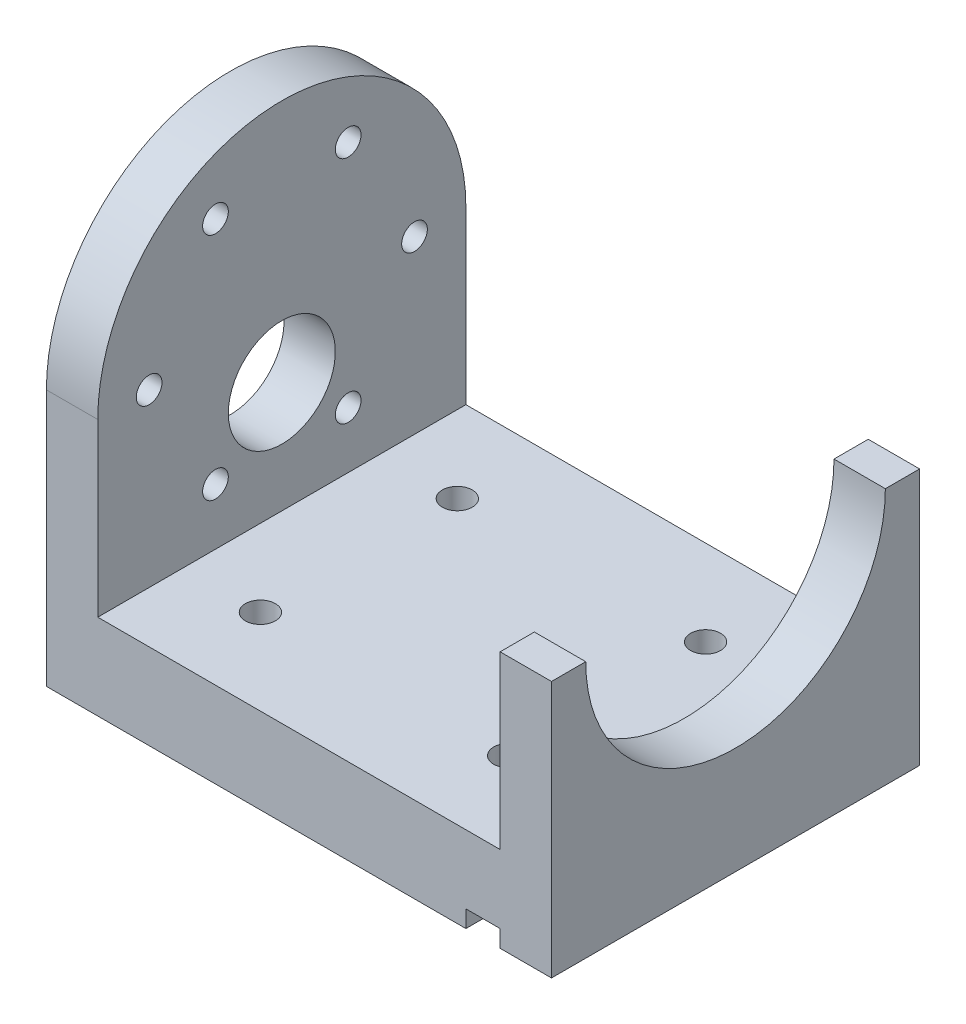
ISO-10303-21;
HEADER;
FILE_DESCRIPTION(('STEP AP214'),'2;1');
FILE_NAME('part.step','',(''),(''),'','','');
FILE_SCHEMA(('AUTOMOTIVE_DESIGN { 1 0 10303 214 1 1 1 1 }'));
ENDSEC;
DATA;
#1=APPLICATION_CONTEXT('core data for automotive mechanical design processes');
#2=APPLICATION_PROTOCOL_DEFINITION('international standard','automotive_design',2000,#1);
#3=PRODUCT_CONTEXT('',#1,'mechanical');
#4=PRODUCT('Part','Part','',(#3));
#5=PRODUCT_RELATED_PRODUCT_CATEGORY('part','',(#4));
#6=PRODUCT_DEFINITION_FORMATION('','',#4);
#7=PRODUCT_DEFINITION_CONTEXT('part definition',#1,'design');
#8=PRODUCT_DEFINITION('design','',#6,#7);
#9=PRODUCT_DEFINITION_SHAPE('','',#8);
#10=(LENGTH_UNIT() NAMED_UNIT(*) SI_UNIT(.MILLI.,.METRE.));
#11=(NAMED_UNIT(*) PLANE_ANGLE_UNIT() SI_UNIT($,.RADIAN.));
#12=(NAMED_UNIT(*) SI_UNIT($,.STERADIAN.) SOLID_ANGLE_UNIT());
#13=UNCERTAINTY_MEASURE_WITH_UNIT(LENGTH_MEASURE(1.E-05),#10,'distance_accuracy_value','');
#14=(GEOMETRIC_REPRESENTATION_CONTEXT(3) GLOBAL_UNCERTAINTY_ASSIGNED_CONTEXT((#13)) GLOBAL_UNIT_ASSIGNED_CONTEXT((#10,
#11,#12)) REPRESENTATION_CONTEXT('',''));
#15=CARTESIAN_POINT('',(0.,0.,0.));
#16=DIRECTION('',(0.,0.,1.));
#17=DIRECTION('',(1.,0.,0.));
#18=AXIS2_PLACEMENT_3D('',#15,#16,#17);
#19=CARTESIAN_POINT('',(0.,10.,0.));
#20=DIRECTION('',(0.,-1.,0.));
#21=DIRECTION('',(0.,0.,-1.));
#22=AXIS2_PLACEMENT_3D('',#19,#20,#21);
#23=PLANE('',#22);
#24=CARTESIAN_POINT('',(44.,10.,-10.));
#25=DIRECTION('',(0.,1.,0.));
#26=DIRECTION('',(0.,0.,1.));
#27=AXIS2_PLACEMENT_3D('',#24,#25,#26);
#28=CIRCLE('',#27,1.75);
#29=CARTESIAN_POINT('',(44.,10.,-8.25));
#30=VERTEX_POINT('',#29);
#31=EDGE_CURVE('E226',#30,#30,#28,.T.);
#32=ORIENTED_EDGE('',*,*,#31,.F.);
#33=EDGE_LOOP('',(#32));
#34=FACE_BOUND('',#33,.T.);
#35=CARTESIAN_POINT('',(44.,10.,-33.));
#36=DIRECTION('',(0.,1.,0.));
#37=DIRECTION('',(0.,0.,-1.));
#38=AXIS2_PLACEMENT_3D('',#35,#36,#37);
#39=CIRCLE('',#38,1.75);
#40=CARTESIAN_POINT('',(44.,10.,-34.75));
#41=VERTEX_POINT('',#40);
#42=EDGE_CURVE('E232',#41,#41,#39,.T.);
#43=ORIENTED_EDGE('',*,*,#42,.F.);
#44=EDGE_LOOP('',(#43));
#45=FACE_BOUND('',#44,.T.);
#46=CARTESIAN_POINT('',(15.,10.,-10.));
#47=DIRECTION('',(0.,1.,0.));
#48=DIRECTION('',(0.,0.,-1.));
#49=AXIS2_PLACEMENT_3D('',#46,#47,#48);
#50=CIRCLE('',#49,1.75);
#51=CARTESIAN_POINT('',(15.,10.,-11.75));
#52=VERTEX_POINT('',#51);
#53=EDGE_CURVE('E238',#52,#52,#50,.T.);
#54=ORIENTED_EDGE('',*,*,#53,.F.);
#55=EDGE_LOOP('',(#54));
#56=FACE_BOUND('',#55,.T.);
#57=CARTESIAN_POINT('',(15.,10.,-33.));
#58=DIRECTION('',(0.,1.,0.));
#59=DIRECTION('',(0.,0.,1.));
#60=AXIS2_PLACEMENT_3D('',#57,#58,#59);
#61=CIRCLE('',#60,1.75);
#62=CARTESIAN_POINT('',(15.,10.,-31.25));
#63=VERTEX_POINT('',#62);
#64=EDGE_CURVE('E244',#63,#63,#61,.T.);
#65=ORIENTED_EDGE('',*,*,#64,.F.);
#66=EDGE_LOOP('',(#65));
#67=FACE_BOUND('',#66,.T.);
#68=DIRECTION('',(0.,0.,1.));
#69=VECTOR('',#68,1.);
#70=CARTESIAN_POINT('',(6.,10.,-43.));
#71=LINE('',#70,#69);
#72=CARTESIAN_POINT('',(6.,10.,-43.));
#73=VERTEX_POINT('',#72);
#74=CARTESIAN_POINT('',(6.,10.,0.));
#75=VERTEX_POINT('',#74);
#76=EDGE_CURVE('E51',#73,#75,#71,.T.);
#77=ORIENTED_EDGE('',*,*,#76,.T.);
#78=DIRECTION('',(1.,0.,0.));
#79=VECTOR('',#78,1.);
#80=CARTESIAN_POINT('',(0.,10.,0.));
#81=LINE('',#80,#79);
#82=CARTESIAN_POINT('',(53.,10.,0.));
#83=VERTEX_POINT('',#82);
#84=EDGE_CURVE('E153',#75,#83,#81,.T.);
#85=ORIENTED_EDGE('',*,*,#84,.T.);
#86=DIRECTION('',(0.,0.,-1.));
#87=VECTOR('',#86,1.);
#88=CARTESIAN_POINT('',(53.,10.,0.));
#89=LINE('',#88,#87);
#90=CARTESIAN_POINT('',(53.,10.,-43.));
#91=VERTEX_POINT('',#90);
#92=EDGE_CURVE('E178',#83,#91,#89,.T.);
#93=ORIENTED_EDGE('',*,*,#92,.T.);
#94=DIRECTION('',(-1.,0.,0.));
#95=VECTOR('',#94,1.);
#96=CARTESIAN_POINT('',(0.,10.,-43.));
#97=LINE('',#96,#95);
#98=EDGE_CURVE('E56',#91,#73,#97,.T.);
#99=ORIENTED_EDGE('',*,*,#98,.T.);
#100=EDGE_LOOP('',(#77,#85,#93,#99));
#101=FACE_BOUND('',#100,.T.);
#102=ADVANCED_FACE('F36',(#34,#45,#56,#67,#101),#23,.F.);
#103=CARTESIAN_POINT('',(0.,0.,0.));
#104=DIRECTION('',(0.,-1.,0.));
#105=DIRECTION('',(0.,0.,-1.));
#106=AXIS2_PLACEMENT_3D('',#103,#104,#105);
#107=PLANE('',#106);
#108=DIRECTION('',(0.,0.,1.));
#109=VECTOR('',#108,1.);
#110=CARTESIAN_POINT('',(53.,0.,0.));
#111=LINE('',#110,#109);
#112=CARTESIAN_POINT('',(53.,0.,-43.));
#113=VERTEX_POINT('',#112);
#114=CARTESIAN_POINT('',(53.,0.,0.));
#115=VERTEX_POINT('',#114);
#116=EDGE_CURVE('E200',#113,#115,#111,.T.);
#117=ORIENTED_EDGE('',*,*,#116,.F.);
#118=DIRECTION('',(-1.,0.,0.));
#119=VECTOR('',#118,1.);
#120=CARTESIAN_POINT('',(0.,0.,-43.));
#121=LINE('',#120,#119);
#122=CARTESIAN_POINT('',(59.,0.,-43.));
#123=VERTEX_POINT('',#122);
#124=EDGE_CURVE('E251',#123,#113,#121,.T.);
#125=ORIENTED_EDGE('',*,*,#124,.F.);
#126=DIRECTION('',(0.,0.,-1.));
#127=VECTOR('',#126,1.);
#128=CARTESIAN_POINT('',(59.,0.,0.));
#129=LINE('',#128,#127);
#130=CARTESIAN_POINT('',(59.,0.,0.));
#131=VERTEX_POINT('',#130);
#132=EDGE_CURVE('E260',#131,#123,#129,.T.);
#133=ORIENTED_EDGE('',*,*,#132,.F.);
#134=DIRECTION('',(1.,0.,0.));
#135=VECTOR('',#134,1.);
#136=CARTESIAN_POINT('',(0.,0.,0.));
#137=LINE('',#136,#135);
#138=EDGE_CURVE('E256',#115,#131,#137,.T.);
#139=ORIENTED_EDGE('',*,*,#138,.F.);
#140=EDGE_LOOP('',(#117,#125,#133,#139));
#141=FACE_BOUND('',#140,.T.);
#142=ADVANCED_FACE('F279',(#141),#107,.T.);
#143=DIRECTION('',(0.,0.,-1.));
#144=VECTOR('',#143,1.);
#145=CARTESIAN_POINT('',(49.,0.,0.));
#146=LINE('',#145,#144);
#147=CARTESIAN_POINT('',(49.,0.,0.));
#148=VERTEX_POINT('',#147);
#149=CARTESIAN_POINT('',(49.,0.,-43.));
#150=VERTEX_POINT('',#149);
#151=EDGE_CURVE('E205',#148,#150,#146,.T.);
#152=ORIENTED_EDGE('',*,*,#151,.F.);
#153=CARTESIAN_POINT('',(0.,0.,0.));
#154=VERTEX_POINT('',#153);
#155=EDGE_CURVE('E257',#154,#148,#137,.T.);
#156=ORIENTED_EDGE('',*,*,#155,.F.);
#157=DIRECTION('',(0.,0.,1.));
#158=VECTOR('',#157,1.);
#159=CARTESIAN_POINT('',(0.,0.,0.));
#160=LINE('',#159,#158);
#161=CARTESIAN_POINT('',(0.,0.,-43.));
#162=VERTEX_POINT('',#161);
#163=EDGE_CURVE('E247',#162,#154,#160,.T.);
#164=ORIENTED_EDGE('',*,*,#163,.F.);
#165=EDGE_CURVE('E262',#150,#162,#121,.T.);
#166=ORIENTED_EDGE('',*,*,#165,.F.);
#167=EDGE_LOOP('',(#152,#156,#164,#166));
#168=FACE_BOUND('',#167,.T.);
#169=CARTESIAN_POINT('',(44.,0.,-33.));
#170=DIRECTION('',(0.,1.,0.));
#171=DIRECTION('',(0.,0.,-1.));
#172=AXIS2_PLACEMENT_3D('',#169,#170,#171);
#173=CIRCLE('',#172,1.75);
#174=CARTESIAN_POINT('',(44.,0.,-34.75));
#175=VERTEX_POINT('',#174);
#176=EDGE_CURVE('E229',#175,#175,#173,.T.);
#177=ORIENTED_EDGE('',*,*,#176,.T.);
#178=EDGE_LOOP('',(#177));
#179=FACE_BOUND('',#178,.T.);
#180=CARTESIAN_POINT('',(15.,0.,-33.));
#181=DIRECTION('',(0.,1.,0.));
#182=DIRECTION('',(0.,0.,1.));
#183=AXIS2_PLACEMENT_3D('',#180,#181,#182);
#184=CIRCLE('',#183,1.75);
#185=CARTESIAN_POINT('',(15.,0.,-31.25));
#186=VERTEX_POINT('',#185);
#187=EDGE_CURVE('E241',#186,#186,#184,.T.);
#188=ORIENTED_EDGE('',*,*,#187,.T.);
#189=EDGE_LOOP('',(#188));
#190=FACE_BOUND('',#189,.T.);
#191=CARTESIAN_POINT('',(15.,0.,-10.));
#192=DIRECTION('',(0.,1.,0.));
#193=DIRECTION('',(0.,0.,-1.));
#194=AXIS2_PLACEMENT_3D('',#191,#192,#193);
#195=CIRCLE('',#194,1.75);
#196=CARTESIAN_POINT('',(15.,0.,-11.75));
#197=VERTEX_POINT('',#196);
#198=EDGE_CURVE('E235',#197,#197,#195,.T.);
#199=ORIENTED_EDGE('',*,*,#198,.T.);
#200=EDGE_LOOP('',(#199));
#201=FACE_BOUND('',#200,.T.);
#202=CARTESIAN_POINT('',(44.,0.,-10.));
#203=DIRECTION('',(0.,1.,0.));
#204=DIRECTION('',(0.,0.,1.));
#205=AXIS2_PLACEMENT_3D('',#202,#203,#204);
#206=CIRCLE('',#205,1.75);
#207=CARTESIAN_POINT('',(44.,0.,-8.25));
#208=VERTEX_POINT('',#207);
#209=EDGE_CURVE('E218',#208,#208,#206,.T.);
#210=ORIENTED_EDGE('',*,*,#209,.T.);
#211=EDGE_LOOP('',(#210));
#212=FACE_BOUND('',#211,.T.);
#213=ADVANCED_FACE('F354',(#168,#179,#190,#201,#212),#107,.T.);
#214=CARTESIAN_POINT('',(0.,10.,0.));
#215=DIRECTION('',(1.,0.,0.));
#216=DIRECTION('',(0.,0.,-1.));
#217=AXIS2_PLACEMENT_3D('',#214,#215,#216);
#218=PLANE('',#217);
#219=ORIENTED_EDGE('',*,*,#163,.T.);
#220=DIRECTION('',(0.,-1.,0.));
#221=VECTOR('',#220,1.);
#222=CARTESIAN_POINT('',(0.,10.,0.));
#223=LINE('',#222,#221);
#224=CARTESIAN_POINT('',(0.,30.,0.));
#225=VERTEX_POINT('',#224);
#226=EDGE_CURVE('E11',#225,#154,#223,.T.);
#227=ORIENTED_EDGE('',*,*,#226,.F.);
#228=CARTESIAN_POINT('',(0.,30.,-21.5));
#229=DIRECTION('',(-1.,0.,0.));
#230=DIRECTION('',(0.,0.,1.));
#231=AXIS2_PLACEMENT_3D('',#228,#229,#230);
#232=CIRCLE('',#231,21.5);
#233=CARTESIAN_POINT('',(0.,30.,-43.));
#234=VERTEX_POINT('',#233);
#235=EDGE_CURVE('E144',#225,#234,#232,.T.);
#236=ORIENTED_EDGE('',*,*,#235,.T.);
#237=DIRECTION('',(0.,-1.,0.));
#238=VECTOR('',#237,1.);
#239=CARTESIAN_POINT('',(0.,10.,-43.));
#240=LINE('',#239,#238);
#241=EDGE_CURVE('E253',#234,#162,#240,.T.);
#242=ORIENTED_EDGE('',*,*,#241,.T.);
#243=EDGE_LOOP('',(#219,#227,#236,#242));
#244=FACE_BOUND('',#243,.T.);
#245=CARTESIAN_POINT('',(0.,43.4233937586588,-13.75));
#246=DIRECTION('',(-1.,0.,0.));
#247=DIRECTION('',(0.,0.,1.));
#248=AXIS2_PLACEMENT_3D('',#245,#246,#247);
#249=CIRCLE('',#248,1.5);
#250=CARTESIAN_POINT('',(0.,43.4233937586588,-12.25));
#251=VERTEX_POINT('',#250);
#252=EDGE_CURVE('E337',#251,#251,#249,.T.);
#253=ORIENTED_EDGE('',*,*,#252,.F.);
#254=EDGE_LOOP('',(#253));
#255=FACE_BOUND('',#254,.T.);
#256=CARTESIAN_POINT('',(0.,43.4233937586588,-29.25));
#257=DIRECTION('',(-1.,0.,0.));
#258=DIRECTION('',(0.,0.,1.));
#259=AXIS2_PLACEMENT_3D('',#256,#257,#258);
#260=CIRCLE('',#259,1.5);
#261=CARTESIAN_POINT('',(0.,43.4233937586588,-27.75));
#262=VERTEX_POINT('',#261);
#263=EDGE_CURVE('E331',#262,#262,#260,.T.);
#264=ORIENTED_EDGE('',*,*,#263,.F.);
#265=EDGE_LOOP('',(#264));
#266=FACE_BOUND('',#265,.T.);
#267=CARTESIAN_POINT('',(0.,30.,-37.));
#268=DIRECTION('',(-1.,0.,0.));
#269=DIRECTION('',(0.,0.,1.));
#270=AXIS2_PLACEMENT_3D('',#267,#268,#269);
#271=CIRCLE('',#270,1.5);
#272=CARTESIAN_POINT('',(0.,30.,-35.5));
#273=VERTEX_POINT('',#272);
#274=EDGE_CURVE('E325',#273,#273,#271,.T.);
#275=ORIENTED_EDGE('',*,*,#274,.F.);
#276=EDGE_LOOP('',(#275));
#277=FACE_BOUND('',#276,.T.);
#278=CARTESIAN_POINT('',(0.,16.5766062413412,-29.25));
#279=DIRECTION('',(-1.,0.,0.));
#280=DIRECTION('',(0.,0.,1.));
#281=AXIS2_PLACEMENT_3D('',#278,#279,#280);
#282=CIRCLE('',#281,1.5);
#283=CARTESIAN_POINT('',(0.,16.5766062413412,-27.75));
#284=VERTEX_POINT('',#283);
#285=EDGE_CURVE('E319',#284,#284,#282,.T.);
#286=ORIENTED_EDGE('',*,*,#285,.F.);
#287=EDGE_LOOP('',(#286));
#288=FACE_BOUND('',#287,.T.);
#289=CARTESIAN_POINT('',(0.,16.5766062413412,-13.75));
#290=DIRECTION('',(-1.,0.,0.));
#291=DIRECTION('',(0.,0.,1.));
#292=AXIS2_PLACEMENT_3D('',#289,#290,#291);
#293=CIRCLE('',#292,1.5);
#294=CARTESIAN_POINT('',(0.,16.5766062413412,-12.25));
#295=VERTEX_POINT('',#294);
#296=EDGE_CURVE('E313',#295,#295,#293,.T.);
#297=ORIENTED_EDGE('',*,*,#296,.F.);
#298=EDGE_LOOP('',(#297));
#299=FACE_BOUND('',#298,.T.);
#300=CARTESIAN_POINT('',(0.,30.,-6.));
#301=DIRECTION('',(-1.,0.,0.));
#302=DIRECTION('',(0.,0.,1.));
#303=AXIS2_PLACEMENT_3D('',#300,#301,#302);
#304=CIRCLE('',#303,1.5);
#305=CARTESIAN_POINT('',(0.,30.,-4.5));
#306=VERTEX_POINT('',#305);
#307=EDGE_CURVE('E307',#306,#306,#304,.T.);
#308=ORIENTED_EDGE('',*,*,#307,.F.);
#309=EDGE_LOOP('',(#308));
#310=FACE_BOUND('',#309,.T.);
#311=CARTESIAN_POINT('',(0.,23.,-21.5));
#312=DIRECTION('',(-1.,0.,0.));
#313=DIRECTION('',(0.,0.,1.));
#314=AXIS2_PLACEMENT_3D('',#311,#312,#313);
#315=CIRCLE('',#314,6.25);
#316=CARTESIAN_POINT('',(0.,23.,-15.25));
#317=VERTEX_POINT('',#316);
#318=EDGE_CURVE('E301',#317,#317,#315,.T.);
#319=ORIENTED_EDGE('',*,*,#318,.F.);
#320=EDGE_LOOP('',(#319));
#321=FACE_BOUND('',#320,.T.);
#322=ADVANCED_FACE('F38',(#244,#255,#266,#277,#288,#299,#310,#321),#218,.F.);
#323=CARTESIAN_POINT('',(0.,10.,0.));
#324=DIRECTION('',(0.,0.,-1.));
#325=DIRECTION('',(-1.,0.,0.));
#326=AXIS2_PLACEMENT_3D('',#323,#324,#325);
#327=PLANE('',#326);
#328=DIRECTION('',(-1.,0.,0.));
#329=VECTOR('',#328,1.);
#330=CARTESIAN_POINT('',(53.,2.,0.));
#331=LINE('',#330,#329);
#332=CARTESIAN_POINT('',(53.,2.,0.));
#333=VERTEX_POINT('',#332);
#334=CARTESIAN_POINT('',(49.,2.,0.));
#335=VERTEX_POINT('',#334);
#336=EDGE_CURVE('E204',#333,#335,#331,.T.);
#337=ORIENTED_EDGE('',*,*,#336,.F.);
#338=DIRECTION('',(0.,-1.,0.));
#339=VECTOR('',#338,1.);
#340=CARTESIAN_POINT('',(53.,2.,0.));
#341=LINE('',#340,#339);
#342=EDGE_CURVE('E213',#333,#115,#341,.T.);
#343=ORIENTED_EDGE('',*,*,#342,.T.);
#344=ORIENTED_EDGE('',*,*,#138,.T.);
#345=DIRECTION('',(0.,-1.,0.));
#346=VECTOR('',#345,1.);
#347=CARTESIAN_POINT('',(59.,10.,0.));
#348=LINE('',#347,#346);
#349=CARTESIAN_POINT('',(59.,30.,0.));
#350=VERTEX_POINT('',#349);
#351=EDGE_CURVE('E44',#350,#131,#348,.T.);
#352=ORIENTED_EDGE('',*,*,#351,.F.);
#353=DIRECTION('',(1.,0.,0.));
#354=VECTOR('',#353,1.);
#355=CARTESIAN_POINT('',(53.,30.,0.));
#356=LINE('',#355,#354);
#357=CARTESIAN_POINT('',(53.,30.,0.));
#358=VERTEX_POINT('',#357);
#359=EDGE_CURVE('E182',#358,#350,#356,.T.);
#360=ORIENTED_EDGE('',*,*,#359,.F.);
#361=DIRECTION('',(0.,1.,0.));
#362=VECTOR('',#361,1.);
#363=CARTESIAN_POINT('',(53.,10.,0.));
#364=LINE('',#363,#362);
#365=EDGE_CURVE('E180',#83,#358,#364,.T.);
#366=ORIENTED_EDGE('',*,*,#365,.F.);
#367=ORIENTED_EDGE('',*,*,#84,.F.);
#368=DIRECTION('',(0.,1.,0.));
#369=VECTOR('',#368,1.);
#370=CARTESIAN_POINT('',(6.,10.,0.));
#371=LINE('',#370,#369);
#372=CARTESIAN_POINT('',(6.,30.,0.));
#373=VERTEX_POINT('',#372);
#374=EDGE_CURVE('E149',#75,#373,#371,.T.);
#375=ORIENTED_EDGE('',*,*,#374,.T.);
#376=DIRECTION('',(-1.,0.,0.));
#377=VECTOR('',#376,1.);
#378=CARTESIAN_POINT('',(6.,30.,0.));
#379=LINE('',#378,#377);
#380=EDGE_CURVE('E137',#373,#225,#379,.T.);
#381=ORIENTED_EDGE('',*,*,#380,.T.);
#382=ORIENTED_EDGE('',*,*,#226,.T.);
#383=ORIENTED_EDGE('',*,*,#155,.T.);
#384=DIRECTION('',(0.,-1.,0.));
#385=VECTOR('',#384,1.);
#386=CARTESIAN_POINT('',(49.,2.,0.));
#387=LINE('',#386,#385);
#388=EDGE_CURVE('E222',#335,#148,#387,.T.);
#389=ORIENTED_EDGE('',*,*,#388,.F.);
#390=EDGE_LOOP('',(#337,#343,#344,#352,#360,#366,#367,#375,#381,#382,#383,#389));
#391=FACE_BOUND('',#390,.T.);
#392=ADVANCED_FACE('F151',(#391),#327,.F.);
#393=CARTESIAN_POINT('',(59.,10.,0.));
#394=DIRECTION('',(-1.,0.,0.));
#395=DIRECTION('',(0.,0.,1.));
#396=AXIS2_PLACEMENT_3D('',#393,#394,#395);
#397=PLANE('',#396);
#398=ORIENTED_EDGE('',*,*,#132,.T.);
#399=DIRECTION('',(0.,-1.,0.));
#400=VECTOR('',#399,1.);
#401=CARTESIAN_POINT('',(59.,10.,-43.));
#402=LINE('',#401,#400);
#403=CARTESIAN_POINT('',(59.,30.,-43.));
#404=VERTEX_POINT('',#403);
#405=EDGE_CURVE('E267',#404,#123,#402,.T.);
#406=ORIENTED_EDGE('',*,*,#405,.F.);
#407=DIRECTION('',(0.,0.,-1.));
#408=VECTOR('',#407,1.);
#409=CARTESIAN_POINT('',(59.,30.,-39.));
#410=LINE('',#409,#408);
#411=CARTESIAN_POINT('',(59.,30.,-39.));
#412=VERTEX_POINT('',#411);
#413=EDGE_CURVE('E171',#412,#404,#410,.T.);
#414=ORIENTED_EDGE('',*,*,#413,.F.);
#415=CARTESIAN_POINT('',(59.,30.,-21.5));
#416=DIRECTION('',(1.,0.,0.));
#417=DIRECTION('',(0.,0.,-1.));
#418=AXIS2_PLACEMENT_3D('',#415,#416,#417);
#419=CIRCLE('',#418,17.5);
#420=CARTESIAN_POINT('',(59.,30.,-3.99999999999999));
#421=VERTEX_POINT('',#420);
#422=EDGE_CURVE('E185',#421,#412,#419,.T.);
#423=ORIENTED_EDGE('',*,*,#422,.F.);
#424=DIRECTION('',(0.,0.,-1.));
#425=VECTOR('',#424,1.);
#426=CARTESIAN_POINT('',(59.,30.,0.));
#427=LINE('',#426,#425);
#428=EDGE_CURVE('E165',#350,#421,#427,.T.);
#429=ORIENTED_EDGE('',*,*,#428,.F.);
#430=ORIENTED_EDGE('',*,*,#351,.T.);
#431=EDGE_LOOP('',(#398,#406,#414,#423,#429,#430));
#432=FACE_BOUND('',#431,.T.);
#433=ADVANCED_FACE('F273',(#432),#397,.F.);
#434=CARTESIAN_POINT('',(0.,10.,-43.));
#435=DIRECTION('',(0.,0.,1.));
#436=DIRECTION('',(1.,0.,0.));
#437=AXIS2_PLACEMENT_3D('',#434,#435,#436);
#438=PLANE('',#437);
#439=ORIENTED_EDGE('',*,*,#124,.T.);
#440=DIRECTION('',(0.,-1.,0.));
#441=VECTOR('',#440,1.);
#442=CARTESIAN_POINT('',(53.,2.,-43.));
#443=LINE('',#442,#441);
#444=CARTESIAN_POINT('',(53.,2.,-43.));
#445=VERTEX_POINT('',#444);
#446=EDGE_CURVE('E216',#445,#113,#443,.T.);
#447=ORIENTED_EDGE('',*,*,#446,.F.);
#448=DIRECTION('',(1.,0.,0.));
#449=VECTOR('',#448,1.);
#450=CARTESIAN_POINT('',(53.,2.,-43.));
#451=LINE('',#450,#449);
#452=CARTESIAN_POINT('',(49.,2.,-43.));
#453=VERTEX_POINT('',#452);
#454=EDGE_CURVE('E210',#453,#445,#451,.T.);
#455=ORIENTED_EDGE('',*,*,#454,.F.);
#456=DIRECTION('',(0.,-1.,0.));
#457=VECTOR('',#456,1.);
#458=CARTESIAN_POINT('',(49.,2.,-43.));
#459=LINE('',#458,#457);
#460=EDGE_CURVE('E219',#453,#150,#459,.T.);
#461=ORIENTED_EDGE('',*,*,#460,.T.);
#462=ORIENTED_EDGE('',*,*,#165,.T.);
#463=ORIENTED_EDGE('',*,*,#241,.F.);
#464=DIRECTION('',(-1.,0.,0.));
#465=VECTOR('',#464,1.);
#466=CARTESIAN_POINT('',(6.,30.,-43.));
#467=LINE('',#466,#465);
#468=CARTESIAN_POINT('',(6.,30.,-43.));
#469=VERTEX_POINT('',#468);
#470=EDGE_CURVE('E146',#469,#234,#467,.T.);
#471=ORIENTED_EDGE('',*,*,#470,.F.);
#472=DIRECTION('',(0.,-1.,0.));
#473=VECTOR('',#472,1.);
#474=CARTESIAN_POINT('',(6.,10.,-43.));
#475=LINE('',#474,#473);
#476=EDGE_CURVE('E159',#469,#73,#475,.T.);
#477=ORIENTED_EDGE('',*,*,#476,.T.);
#478=ORIENTED_EDGE('',*,*,#98,.F.);
#479=DIRECTION('',(0.,1.,0.));
#480=VECTOR('',#479,1.);
#481=CARTESIAN_POINT('',(53.,10.,-43.));
#482=LINE('',#481,#480);
#483=CARTESIAN_POINT('',(53.,30.,-43.));
#484=VERTEX_POINT('',#483);
#485=EDGE_CURVE('E175',#91,#484,#482,.T.);
#486=ORIENTED_EDGE('',*,*,#485,.T.);
#487=DIRECTION('',(1.,0.,0.));
#488=VECTOR('',#487,1.);
#489=CARTESIAN_POINT('',(53.,30.,-43.));
#490=LINE('',#489,#488);
#491=EDGE_CURVE('E191',#484,#404,#490,.T.);
#492=ORIENTED_EDGE('',*,*,#491,.T.);
#493=ORIENTED_EDGE('',*,*,#405,.T.);
#494=EDGE_LOOP('',(#439,#447,#455,#461,#462,#463,#471,#477,#478,#486,#492,#493));
#495=FACE_BOUND('',#494,.T.);
#496=ADVANCED_FACE('F282',(#495),#438,.F.);
#497=CARTESIAN_POINT('',(15.,10.,-33.));
#498=DIRECTION('',(0.,-1.,0.));
#499=DIRECTION('',(0.,0.,-1.));
#500=AXIS2_PLACEMENT_3D('',#497,#498,#499);
#501=CYLINDRICAL_SURFACE('',#500,1.75);
#502=ORIENTED_EDGE('',*,*,#64,.T.);
#503=EDGE_LOOP('',(#502));
#504=FACE_BOUND('',#503,.T.);
#505=ORIENTED_EDGE('',*,*,#187,.F.);
#506=EDGE_LOOP('',(#505));
#507=FACE_BOUND('',#506,.T.);
#508=ADVANCED_FACE('F392',(#504,#507),#501,.F.);
#509=CARTESIAN_POINT('',(15.,10.,-10.));
#510=DIRECTION('',(0.,-1.,0.));
#511=DIRECTION('',(0.,0.,-1.));
#512=AXIS2_PLACEMENT_3D('',#509,#510,#511);
#513=CYLINDRICAL_SURFACE('',#512,1.75);
#514=ORIENTED_EDGE('',*,*,#53,.T.);
#515=EDGE_LOOP('',(#514));
#516=FACE_BOUND('',#515,.T.);
#517=ORIENTED_EDGE('',*,*,#198,.F.);
#518=EDGE_LOOP('',(#517));
#519=FACE_BOUND('',#518,.T.);
#520=ADVANCED_FACE('F422',(#516,#519),#513,.F.);
#521=CARTESIAN_POINT('',(44.,10.,-33.));
#522=DIRECTION('',(0.,-1.,0.));
#523=DIRECTION('',(0.,0.,-1.));
#524=AXIS2_PLACEMENT_3D('',#521,#522,#523);
#525=CYLINDRICAL_SURFACE('',#524,1.75);
#526=ORIENTED_EDGE('',*,*,#42,.T.);
#527=EDGE_LOOP('',(#526));
#528=FACE_BOUND('',#527,.T.);
#529=ORIENTED_EDGE('',*,*,#176,.F.);
#530=EDGE_LOOP('',(#529));
#531=FACE_BOUND('',#530,.T.);
#532=ADVANCED_FACE('F429',(#528,#531),#525,.F.);
#533=CARTESIAN_POINT('',(44.,10.,-10.));
#534=DIRECTION('',(0.,-1.,0.));
#535=DIRECTION('',(0.,0.,-1.));
#536=AXIS2_PLACEMENT_3D('',#533,#534,#535);
#537=CYLINDRICAL_SURFACE('',#536,1.75);
#538=ORIENTED_EDGE('',*,*,#31,.T.);
#539=EDGE_LOOP('',(#538));
#540=FACE_BOUND('',#539,.T.);
#541=ORIENTED_EDGE('',*,*,#209,.F.);
#542=EDGE_LOOP('',(#541));
#543=FACE_BOUND('',#542,.T.);
#544=ADVANCED_FACE('F436',(#540,#543),#537,.F.);
#545=CARTESIAN_POINT('',(53.,2.,0.));
#546=DIRECTION('',(1.,0.,0.));
#547=DIRECTION('',(0.,0.,-1.));
#548=AXIS2_PLACEMENT_3D('',#545,#546,#547);
#549=PLANE('',#548);
#550=ORIENTED_EDGE('',*,*,#116,.T.);
#551=ORIENTED_EDGE('',*,*,#342,.F.);
#552=DIRECTION('',(0.,0.,1.));
#553=VECTOR('',#552,1.);
#554=CARTESIAN_POINT('',(53.,2.,0.));
#555=LINE('',#554,#553);
#556=EDGE_CURVE('E201',#445,#333,#555,.T.);
#557=ORIENTED_EDGE('',*,*,#556,.F.);
#558=ORIENTED_EDGE('',*,*,#446,.T.);
#559=EDGE_LOOP('',(#550,#551,#557,#558));
#560=FACE_BOUND('',#559,.T.);
#561=ADVANCED_FACE('F444',(#560),#549,.F.);
#562=CARTESIAN_POINT('',(49.,2.,0.));
#563=DIRECTION('',(-1.,0.,0.));
#564=DIRECTION('',(0.,0.,1.));
#565=AXIS2_PLACEMENT_3D('',#562,#563,#564);
#566=PLANE('',#565);
#567=ORIENTED_EDGE('',*,*,#151,.T.);
#568=ORIENTED_EDGE('',*,*,#460,.F.);
#569=DIRECTION('',(0.,0.,-1.));
#570=VECTOR('',#569,1.);
#571=CARTESIAN_POINT('',(49.,2.,0.));
#572=LINE('',#571,#570);
#573=EDGE_CURVE('E208',#335,#453,#572,.T.);
#574=ORIENTED_EDGE('',*,*,#573,.F.);
#575=ORIENTED_EDGE('',*,*,#388,.T.);
#576=EDGE_LOOP('',(#567,#568,#574,#575));
#577=FACE_BOUND('',#576,.T.);
#578=ADVANCED_FACE('F453',(#577),#566,.F.);
#579=CARTESIAN_POINT('',(0.,2.,0.));
#580=DIRECTION('',(0.,1.,0.));
#581=DIRECTION('',(0.,0.,1.));
#582=AXIS2_PLACEMENT_3D('',#579,#580,#581);
#583=PLANE('',#582);
#584=ORIENTED_EDGE('',*,*,#556,.T.);
#585=ORIENTED_EDGE('',*,*,#336,.T.);
#586=ORIENTED_EDGE('',*,*,#573,.T.);
#587=ORIENTED_EDGE('',*,*,#454,.T.);
#588=EDGE_LOOP('',(#584,#585,#586,#587));
#589=FACE_BOUND('',#588,.T.);
#590=ADVANCED_FACE('F462',(#589),#583,.F.);
#591=CARTESIAN_POINT('',(53.,30.,0.));
#592=DIRECTION('',(0.,-1.,0.));
#593=DIRECTION('',(0.,0.,-1.));
#594=AXIS2_PLACEMENT_3D('',#591,#592,#593);
#595=PLANE('',#594);
#596=ORIENTED_EDGE('',*,*,#428,.T.);
#597=DIRECTION('',(1.,0.,0.));
#598=VECTOR('',#597,1.);
#599=CARTESIAN_POINT('',(53.,30.,-3.99999999999999));
#600=LINE('',#599,#598);
#601=CARTESIAN_POINT('',(53.,30.,-3.99999999999999));
#602=VERTEX_POINT('',#601);
#603=EDGE_CURVE('E197',#602,#421,#600,.T.);
#604=ORIENTED_EDGE('',*,*,#603,.F.);
#605=DIRECTION('',(0.,0.,-1.));
#606=VECTOR('',#605,1.);
#607=CARTESIAN_POINT('',(53.,30.,0.));
#608=LINE('',#607,#606);
#609=EDGE_CURVE('E167',#358,#602,#608,.T.);
#610=ORIENTED_EDGE('',*,*,#609,.F.);
#611=ORIENTED_EDGE('',*,*,#359,.T.);
#612=EDGE_LOOP('',(#596,#604,#610,#611));
#613=FACE_BOUND('',#612,.T.);
#614=ADVANCED_FACE('F295',(#613),#595,.F.);
#615=CARTESIAN_POINT('',(53.,30.,-21.5));
#616=DIRECTION('',(1.,0.,0.));
#617=DIRECTION('',(0.,0.,-1.));
#618=AXIS2_PLACEMENT_3D('',#615,#616,#617);
#619=CYLINDRICAL_SURFACE('',#618,17.5);
#620=ORIENTED_EDGE('',*,*,#422,.T.);
#621=DIRECTION('',(1.,0.,0.));
#622=VECTOR('',#621,1.);
#623=CARTESIAN_POINT('',(53.,30.,-39.));
#624=LINE('',#623,#622);
#625=CARTESIAN_POINT('',(53.,30.,-39.));
#626=VERTEX_POINT('',#625);
#627=EDGE_CURVE('E194',#626,#412,#624,.T.);
#628=ORIENTED_EDGE('',*,*,#627,.F.);
#629=CARTESIAN_POINT('',(53.,30.,-21.5));
#630=DIRECTION('',(1.,0.,0.));
#631=DIRECTION('',(0.,0.,-1.));
#632=AXIS2_PLACEMENT_3D('',#629,#630,#631);
#633=CIRCLE('',#632,17.5);
#634=EDGE_CURVE('E170',#602,#626,#633,.T.);
#635=ORIENTED_EDGE('',*,*,#634,.F.);
#636=ORIENTED_EDGE('',*,*,#603,.T.);
#637=EDGE_LOOP('',(#620,#628,#635,#636));
#638=FACE_BOUND('',#637,.T.);
#639=ADVANCED_FACE('F291',(#638),#619,.F.);
#640=CARTESIAN_POINT('',(53.,30.,-39.));
#641=DIRECTION('',(0.,-1.,0.));
#642=DIRECTION('',(0.,0.,-1.));
#643=AXIS2_PLACEMENT_3D('',#640,#641,#642);
#644=PLANE('',#643);
#645=ORIENTED_EDGE('',*,*,#413,.T.);
#646=ORIENTED_EDGE('',*,*,#491,.F.);
#647=DIRECTION('',(0.,0.,-1.));
#648=VECTOR('',#647,1.);
#649=CARTESIAN_POINT('',(53.,30.,-39.));
#650=LINE('',#649,#648);
#651=EDGE_CURVE('E173',#626,#484,#650,.T.);
#652=ORIENTED_EDGE('',*,*,#651,.F.);
#653=ORIENTED_EDGE('',*,*,#627,.T.);
#654=EDGE_LOOP('',(#645,#646,#652,#653));
#655=FACE_BOUND('',#654,.T.);
#656=ADVANCED_FACE('F287',(#655),#644,.F.);
#657=CARTESIAN_POINT('',(53.,30.,-21.5));
#658=DIRECTION('',(1.,0.,0.));
#659=DIRECTION('',(0.,0.,-1.));
#660=AXIS2_PLACEMENT_3D('',#657,#658,#659);
#661=PLANE('',#660);
#662=ORIENTED_EDGE('',*,*,#609,.T.);
#663=ORIENTED_EDGE('',*,*,#634,.T.);
#664=ORIENTED_EDGE('',*,*,#651,.T.);
#665=ORIENTED_EDGE('',*,*,#485,.F.);
#666=ORIENTED_EDGE('',*,*,#92,.F.);
#667=ORIENTED_EDGE('',*,*,#365,.T.);
#668=EDGE_LOOP('',(#662,#663,#664,#665,#666,#667));
#669=FACE_BOUND('',#668,.T.);
#670=ADVANCED_FACE('F298',(#669),#661,.F.);
#671=CARTESIAN_POINT('',(6.,30.,-21.5));
#672=DIRECTION('',(-1.,0.,0.));
#673=DIRECTION('',(0.,0.,1.));
#674=AXIS2_PLACEMENT_3D('',#671,#672,#673);
#675=CYLINDRICAL_SURFACE('',#674,21.5);
#676=ORIENTED_EDGE('',*,*,#235,.F.);
#677=ORIENTED_EDGE('',*,*,#380,.F.);
#678=CARTESIAN_POINT('',(6.,30.,-21.5));
#679=DIRECTION('',(-1.,0.,0.));
#680=DIRECTION('',(0.,0.,1.));
#681=AXIS2_PLACEMENT_3D('',#678,#679,#680);
#682=CIRCLE('',#681,21.5);
#683=EDGE_CURVE('E142',#373,#469,#682,.T.);
#684=ORIENTED_EDGE('',*,*,#683,.T.);
#685=ORIENTED_EDGE('',*,*,#470,.T.);
#686=EDGE_LOOP('',(#676,#677,#684,#685));
#687=FACE_BOUND('',#686,.T.);
#688=ADVANCED_FACE('F139',(#687),#675,.T.);
#689=CARTESIAN_POINT('',(6.,30.,-21.5));
#690=DIRECTION('',(-1.,0.,0.));
#691=DIRECTION('',(0.,0.,1.));
#692=AXIS2_PLACEMENT_3D('',#689,#690,#691);
#693=PLANE('',#692);
#694=CARTESIAN_POINT('',(6.,43.4233937586588,-13.75));
#695=DIRECTION('',(-1.,0.,0.));
#696=DIRECTION('',(0.,0.,1.));
#697=AXIS2_PLACEMENT_3D('',#694,#695,#696);
#698=CIRCLE('',#697,1.5);
#699=CARTESIAN_POINT('',(6.,43.4233937586588,-12.25));
#700=VERTEX_POINT('',#699);
#701=EDGE_CURVE('E334',#700,#700,#698,.T.);
#702=ORIENTED_EDGE('',*,*,#701,.T.);
#703=EDGE_LOOP('',(#702));
#704=FACE_BOUND('',#703,.T.);
#705=CARTESIAN_POINT('',(6.,43.4233937586588,-29.25));
#706=DIRECTION('',(-1.,0.,0.));
#707=DIRECTION('',(0.,0.,1.));
#708=AXIS2_PLACEMENT_3D('',#705,#706,#707);
#709=CIRCLE('',#708,1.5);
#710=CARTESIAN_POINT('',(6.,43.4233937586588,-27.75));
#711=VERTEX_POINT('',#710);
#712=EDGE_CURVE('E328',#711,#711,#709,.T.);
#713=ORIENTED_EDGE('',*,*,#712,.T.);
#714=EDGE_LOOP('',(#713));
#715=FACE_BOUND('',#714,.T.);
#716=CARTESIAN_POINT('',(6.,30.,-37.));
#717=DIRECTION('',(-1.,0.,0.));
#718=DIRECTION('',(0.,0.,1.));
#719=AXIS2_PLACEMENT_3D('',#716,#717,#718);
#720=CIRCLE('',#719,1.5);
#721=CARTESIAN_POINT('',(6.,30.,-35.5));
#722=VERTEX_POINT('',#721);
#723=EDGE_CURVE('E322',#722,#722,#720,.T.);
#724=ORIENTED_EDGE('',*,*,#723,.T.);
#725=EDGE_LOOP('',(#724));
#726=FACE_BOUND('',#725,.T.);
#727=CARTESIAN_POINT('',(6.,16.5766062413412,-29.25));
#728=DIRECTION('',(-1.,0.,0.));
#729=DIRECTION('',(0.,0.,1.));
#730=AXIS2_PLACEMENT_3D('',#727,#728,#729);
#731=CIRCLE('',#730,1.5);
#732=CARTESIAN_POINT('',(6.,16.5766062413412,-27.75));
#733=VERTEX_POINT('',#732);
#734=EDGE_CURVE('E316',#733,#733,#731,.T.);
#735=ORIENTED_EDGE('',*,*,#734,.T.);
#736=EDGE_LOOP('',(#735));
#737=FACE_BOUND('',#736,.T.);
#738=CARTESIAN_POINT('',(6.,16.5766062413412,-13.75));
#739=DIRECTION('',(-1.,0.,0.));
#740=DIRECTION('',(0.,0.,1.));
#741=AXIS2_PLACEMENT_3D('',#738,#739,#740);
#742=CIRCLE('',#741,1.5);
#743=CARTESIAN_POINT('',(6.,16.5766062413412,-12.25));
#744=VERTEX_POINT('',#743);
#745=EDGE_CURVE('E310',#744,#744,#742,.T.);
#746=ORIENTED_EDGE('',*,*,#745,.T.);
#747=EDGE_LOOP('',(#746));
#748=FACE_BOUND('',#747,.T.);
#749=CARTESIAN_POINT('',(6.,30.,-6.));
#750=DIRECTION('',(-1.,0.,0.));
#751=DIRECTION('',(0.,0.,1.));
#752=AXIS2_PLACEMENT_3D('',#749,#750,#751);
#753=CIRCLE('',#752,1.5);
#754=CARTESIAN_POINT('',(6.,30.,-4.5));
#755=VERTEX_POINT('',#754);
#756=EDGE_CURVE('E304',#755,#755,#753,.T.);
#757=ORIENTED_EDGE('',*,*,#756,.T.);
#758=EDGE_LOOP('',(#757));
#759=FACE_BOUND('',#758,.T.);
#760=CARTESIAN_POINT('',(6.,23.,-21.5));
#761=DIRECTION('',(-1.,0.,0.));
#762=DIRECTION('',(0.,0.,1.));
#763=AXIS2_PLACEMENT_3D('',#760,#761,#762);
#764=CIRCLE('',#763,6.25);
#765=CARTESIAN_POINT('',(6.,23.,-15.25));
#766=VERTEX_POINT('',#765);
#767=EDGE_CURVE('E164',#766,#766,#764,.T.);
#768=ORIENTED_EDGE('',*,*,#767,.T.);
#769=EDGE_LOOP('',(#768));
#770=FACE_BOUND('',#769,.T.);
#771=ORIENTED_EDGE('',*,*,#476,.F.);
#772=ORIENTED_EDGE('',*,*,#683,.F.);
#773=ORIENTED_EDGE('',*,*,#374,.F.);
#774=ORIENTED_EDGE('',*,*,#76,.F.);
#775=EDGE_LOOP('',(#771,#772,#773,#774));
#776=FACE_BOUND('',#775,.T.);
#777=ADVANCED_FACE('F157',(#704,#715,#726,#737,#748,#759,#770,#776),#693,.F.);
#778=CARTESIAN_POINT('',(6.,23.,-21.5));
#779=DIRECTION('',(-1.,0.,0.));
#780=DIRECTION('',(0.,0.,1.));
#781=AXIS2_PLACEMENT_3D('',#778,#779,#780);
#782=CYLINDRICAL_SURFACE('',#781,6.25);
#783=ORIENTED_EDGE('',*,*,#767,.F.);
#784=EDGE_LOOP('',(#783));
#785=FACE_BOUND('',#784,.T.);
#786=ORIENTED_EDGE('',*,*,#318,.T.);
#787=EDGE_LOOP('',(#786));
#788=FACE_BOUND('',#787,.T.);
#789=ADVANCED_FACE('F368',(#785,#788),#782,.F.);
#790=CARTESIAN_POINT('',(6.,30.,-6.));
#791=DIRECTION('',(-1.,0.,0.));
#792=DIRECTION('',(0.,0.,1.));
#793=AXIS2_PLACEMENT_3D('',#790,#791,#792);
#794=CYLINDRICAL_SURFACE('',#793,1.5);
#795=ORIENTED_EDGE('',*,*,#756,.F.);
#796=EDGE_LOOP('',(#795));
#797=FACE_BOUND('',#796,.T.);
#798=ORIENTED_EDGE('',*,*,#307,.T.);
#799=EDGE_LOOP('',(#798));
#800=FACE_BOUND('',#799,.T.);
#801=ADVANCED_FACE('F370',(#797,#800),#794,.F.);
#802=CARTESIAN_POINT('',(6.,16.5766062413412,-13.75));
#803=DIRECTION('',(-1.,0.,0.));
#804=DIRECTION('',(0.,0.,1.));
#805=AXIS2_PLACEMENT_3D('',#802,#803,#804);
#806=CYLINDRICAL_SURFACE('',#805,1.5);
#807=ORIENTED_EDGE('',*,*,#745,.F.);
#808=EDGE_LOOP('',(#807));
#809=FACE_BOUND('',#808,.T.);
#810=ORIENTED_EDGE('',*,*,#296,.T.);
#811=EDGE_LOOP('',(#810));
#812=FACE_BOUND('',#811,.T.);
#813=ADVANCED_FACE('F377',(#809,#812),#806,.F.);
#814=CARTESIAN_POINT('',(6.,16.5766062413412,-29.25));
#815=DIRECTION('',(-1.,0.,0.));
#816=DIRECTION('',(0.,0.,1.));
#817=AXIS2_PLACEMENT_3D('',#814,#815,#816);
#818=CYLINDRICAL_SURFACE('',#817,1.5);
#819=ORIENTED_EDGE('',*,*,#734,.F.);
#820=EDGE_LOOP('',(#819));
#821=FACE_BOUND('',#820,.T.);
#822=ORIENTED_EDGE('',*,*,#285,.T.);
#823=EDGE_LOOP('',(#822));
#824=FACE_BOUND('',#823,.T.);
#825=ADVANCED_FACE('F521',(#821,#824),#818,.F.);
#826=CARTESIAN_POINT('',(6.,30.,-37.));
#827=DIRECTION('',(-1.,0.,0.));
#828=DIRECTION('',(0.,0.,1.));
#829=AXIS2_PLACEMENT_3D('',#826,#827,#828);
#830=CYLINDRICAL_SURFACE('',#829,1.5);
#831=ORIENTED_EDGE('',*,*,#723,.F.);
#832=EDGE_LOOP('',(#831));
#833=FACE_BOUND('',#832,.T.);
#834=ORIENTED_EDGE('',*,*,#274,.T.);
#835=EDGE_LOOP('',(#834));
#836=FACE_BOUND('',#835,.T.);
#837=ADVANCED_FACE('F531',(#833,#836),#830,.F.);
#838=CARTESIAN_POINT('',(6.,43.4233937586588,-29.25));
#839=DIRECTION('',(-1.,0.,0.));
#840=DIRECTION('',(0.,0.,1.));
#841=AXIS2_PLACEMENT_3D('',#838,#839,#840);
#842=CYLINDRICAL_SURFACE('',#841,1.5);
#843=ORIENTED_EDGE('',*,*,#712,.F.);
#844=EDGE_LOOP('',(#843));
#845=FACE_BOUND('',#844,.T.);
#846=ORIENTED_EDGE('',*,*,#263,.T.);
#847=EDGE_LOOP('',(#846));
#848=FACE_BOUND('',#847,.T.);
#849=ADVANCED_FACE('F348',(#845,#848),#842,.F.);
#850=CARTESIAN_POINT('',(6.,43.4233937586588,-13.75));
#851=DIRECTION('',(-1.,0.,0.));
#852=DIRECTION('',(0.,0.,1.));
#853=AXIS2_PLACEMENT_3D('',#850,#851,#852);
#854=CYLINDRICAL_SURFACE('',#853,1.5);
#855=ORIENTED_EDGE('',*,*,#701,.F.);
#856=EDGE_LOOP('',(#855));
#857=FACE_BOUND('',#856,.T.);
#858=ORIENTED_EDGE('',*,*,#252,.T.);
#859=EDGE_LOOP('',(#858));
#860=FACE_BOUND('',#859,.T.);
#861=ADVANCED_FACE('F345',(#857,#860),#854,.F.);
#862=CLOSED_SHELL('',(#102,#142,#213,#322,#392,#433,#496,#508,#520,#532,#544,#561,#578,#590,
#614,#639,#656,#670,#688,#777,#789,#801,#813,#825,#837,#849,#861));
#863=MANIFOLD_SOLID_BREP('B2',#862);
#864=ADVANCED_BREP_SHAPE_REPRESENTATION('',(#18,#863),#14);
#865=SHAPE_DEFINITION_REPRESENTATION(#9,#864);
ENDSEC;
END-ISO-10303-21;
